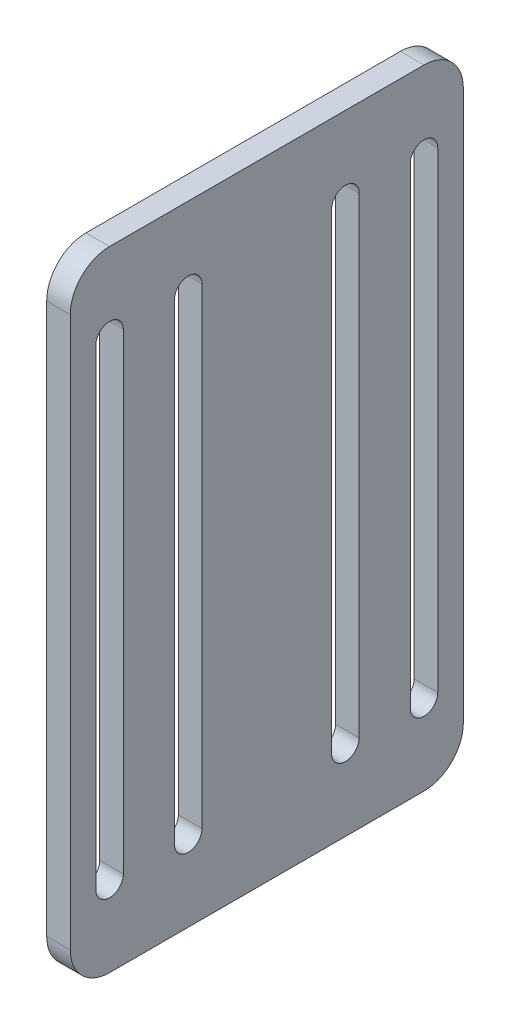
ISO-10303-21;
HEADER;
FILE_DESCRIPTION(('STEP AP214'),'2;1');
FILE_NAME('part.step','',(''),(''),'','','');
FILE_SCHEMA(('AUTOMOTIVE_DESIGN { 1 0 10303 214 1 1 1 1 }'));
ENDSEC;
DATA;
#1=APPLICATION_CONTEXT('core data for automotive mechanical design processes');
#2=APPLICATION_PROTOCOL_DEFINITION('international standard','automotive_design',2000,#1);
#3=PRODUCT_CONTEXT('',#1,'mechanical');
#4=PRODUCT('Part','Part','',(#3));
#5=PRODUCT_RELATED_PRODUCT_CATEGORY('part','',(#4));
#6=PRODUCT_DEFINITION_FORMATION('','',#4);
#7=PRODUCT_DEFINITION_CONTEXT('part definition',#1,'design');
#8=PRODUCT_DEFINITION('design','',#6,#7);
#9=PRODUCT_DEFINITION_SHAPE('','',#8);
#10=(LENGTH_UNIT() NAMED_UNIT(*) SI_UNIT(.MILLI.,.METRE.));
#11=(NAMED_UNIT(*) PLANE_ANGLE_UNIT() SI_UNIT($,.RADIAN.));
#12=(NAMED_UNIT(*) SI_UNIT($,.STERADIAN.) SOLID_ANGLE_UNIT());
#13=UNCERTAINTY_MEASURE_WITH_UNIT(LENGTH_MEASURE(1.E-05),#10,'distance_accuracy_value','');
#14=(GEOMETRIC_REPRESENTATION_CONTEXT(3) GLOBAL_UNCERTAINTY_ASSIGNED_CONTEXT((#13)) GLOBAL_UNIT_ASSIGNED_CONTEXT((#10,
#11,#12)) REPRESENTATION_CONTEXT('',''));
#15=CARTESIAN_POINT('',(0.,0.,0.));
#16=DIRECTION('',(0.,0.,1.));
#17=DIRECTION('',(1.,0.,0.));
#18=AXIS2_PLACEMENT_3D('',#15,#16,#17);
#19=CARTESIAN_POINT('',(3.,0.,-25.));
#20=DIRECTION('',(0.,0.,-1.));
#21=DIRECTION('',(0.,1.,0.));
#22=AXIS2_PLACEMENT_3D('',#19,#20,#21);
#23=PLANE('',#22);
#24=DIRECTION('',(0.,-1.,0.));
#25=VECTOR('',#24,1.);
#26=CARTESIAN_POINT('',(3.,0.,-25.));
#27=LINE('',#26,#25);
#28=CARTESIAN_POINT('',(3.,35.,-25.));
#29=VERTEX_POINT('',#28);
#30=CARTESIAN_POINT('',(3.,-35.,-25.));
#31=VERTEX_POINT('',#30);
#32=EDGE_CURVE('E269',#29,#31,#27,.T.);
#33=ORIENTED_EDGE('',*,*,#32,.T.);
#34=DIRECTION('',(-1.,0.,0.));
#35=VECTOR('',#34,1.);
#36=CARTESIAN_POINT('',(0.,-35.,-25.));
#37=LINE('',#36,#35);
#38=CARTESIAN_POINT('',(0.,-35.,-25.));
#39=VERTEX_POINT('',#38);
#40=EDGE_CURVE('E365',#31,#39,#37,.T.);
#41=ORIENTED_EDGE('',*,*,#40,.T.);
#42=DIRECTION('',(0.,-1.,0.));
#43=VECTOR('',#42,1.);
#44=CARTESIAN_POINT('',(0.,0.,-25.));
#45=LINE('',#44,#43);
#46=CARTESIAN_POINT('',(0.,35.,-25.));
#47=VERTEX_POINT('',#46);
#48=EDGE_CURVE('E326',#47,#39,#45,.T.);
#49=ORIENTED_EDGE('',*,*,#48,.F.);
#50=DIRECTION('',(-1.,0.,0.));
#51=VECTOR('',#50,1.);
#52=CARTESIAN_POINT('',(3.,35.,-25.));
#53=LINE('',#52,#51);
#54=EDGE_CURVE('E345',#47,#29,#53,.F.);
#55=ORIENTED_EDGE('',*,*,#54,.T.);
#56=EDGE_LOOP('',(#33,#41,#49,#55));
#57=FACE_BOUND('',#56,.T.);
#58=ADVANCED_FACE('F41',(#57),#23,.T.);
#59=CARTESIAN_POINT('',(3.,40.,0.));
#60=DIRECTION('',(0.,1.,0.));
#61=DIRECTION('',(0.,0.,1.));
#62=AXIS2_PLACEMENT_3D('',#59,#60,#61);
#63=PLANE('',#62);
#64=DIRECTION('',(0.,0.,-1.));
#65=VECTOR('',#64,1.);
#66=CARTESIAN_POINT('',(0.,40.,0.));
#67=LINE('',#66,#65);
#68=CARTESIAN_POINT('',(0.,40.,20.));
#69=VERTEX_POINT('',#68);
#70=CARTESIAN_POINT('',(0.,40.,-20.));
#71=VERTEX_POINT('',#70);
#72=EDGE_CURVE('E329',#69,#71,#67,.T.);
#73=ORIENTED_EDGE('',*,*,#72,.F.);
#74=DIRECTION('',(-1.,0.,0.));
#75=VECTOR('',#74,1.);
#76=CARTESIAN_POINT('',(3.,40.,20.));
#77=LINE('',#76,#75);
#78=CARTESIAN_POINT('',(3.,40.,20.));
#79=VERTEX_POINT('',#78);
#80=EDGE_CURVE('E11',#69,#79,#77,.F.);
#81=ORIENTED_EDGE('',*,*,#80,.T.);
#82=DIRECTION('',(0.,0.,-1.));
#83=VECTOR('',#82,1.);
#84=CARTESIAN_POINT('',(3.,40.,0.));
#85=LINE('',#84,#83);
#86=CARTESIAN_POINT('',(3.,40.,-20.));
#87=VERTEX_POINT('',#86);
#88=EDGE_CURVE('E272',#79,#87,#85,.T.);
#89=ORIENTED_EDGE('',*,*,#88,.T.);
#90=DIRECTION('',(-1.,0.,0.));
#91=VECTOR('',#90,1.);
#92=CARTESIAN_POINT('',(3.,40.,-20.));
#93=LINE('',#92,#91);
#94=EDGE_CURVE('E49',#87,#71,#93,.T.);
#95=ORIENTED_EDGE('',*,*,#94,.T.);
#96=EDGE_LOOP('',(#73,#81,#89,#95));
#97=FACE_BOUND('',#96,.T.);
#98=ADVANCED_FACE('F395',(#97),#63,.T.);
#99=CARTESIAN_POINT('',(3.,0.,25.));
#100=DIRECTION('',(0.,0.,-1.));
#101=DIRECTION('',(0.,1.,0.));
#102=AXIS2_PLACEMENT_3D('',#99,#100,#101);
#103=PLANE('',#102);
#104=DIRECTION('',(0.,-1.,0.));
#105=VECTOR('',#104,1.);
#106=CARTESIAN_POINT('',(0.,0.,25.));
#107=LINE('',#106,#105);
#108=CARTESIAN_POINT('',(0.,35.,25.));
#109=VERTEX_POINT('',#108);
#110=CARTESIAN_POINT('',(0.,-35.,25.));
#111=VERTEX_POINT('',#110);
#112=EDGE_CURVE('E332',#109,#111,#107,.T.);
#113=ORIENTED_EDGE('',*,*,#112,.T.);
#114=DIRECTION('',(-1.,0.,0.));
#115=VECTOR('',#114,1.);
#116=CARTESIAN_POINT('',(3.,-35.,25.));
#117=LINE('',#116,#115);
#118=CARTESIAN_POINT('',(3.,-35.,25.));
#119=VERTEX_POINT('',#118);
#120=EDGE_CURVE('E56',#111,#119,#117,.F.);
#121=ORIENTED_EDGE('',*,*,#120,.T.);
#122=DIRECTION('',(0.,-1.,0.));
#123=VECTOR('',#122,1.);
#124=CARTESIAN_POINT('',(3.,0.,25.));
#125=LINE('',#124,#123);
#126=CARTESIAN_POINT('',(3.,35.,25.));
#127=VERTEX_POINT('',#126);
#128=EDGE_CURVE('E275',#127,#119,#125,.T.);
#129=ORIENTED_EDGE('',*,*,#128,.F.);
#130=DIRECTION('',(-1.,0.,0.));
#131=VECTOR('',#130,1.);
#132=CARTESIAN_POINT('',(0.,35.,25.));
#133=LINE('',#132,#131);
#134=EDGE_CURVE('E388',#127,#109,#133,.T.);
#135=ORIENTED_EDGE('',*,*,#134,.T.);
#136=EDGE_LOOP('',(#113,#121,#129,#135));
#137=FACE_BOUND('',#136,.T.);
#138=ADVANCED_FACE('F406',(#137),#103,.F.);
#139=CARTESIAN_POINT('',(3.,-30.,20.));
#140=DIRECTION('',(-1.,0.,0.));
#141=DIRECTION('',(0.,0.,1.));
#142=AXIS2_PLACEMENT_3D('',#139,#140,#141);
#143=CYLINDRICAL_SURFACE('',#142,1.74999999999999);
#144=CARTESIAN_POINT('',(0.,-30.,20.));
#145=DIRECTION('',(1.,0.,0.));
#146=DIRECTION('',(0.,0.,-1.));
#147=AXIS2_PLACEMENT_3D('',#144,#145,#146);
#148=CIRCLE('',#147,1.74999999999999);
#149=CARTESIAN_POINT('',(0.,-30.,21.75));
#150=VERTEX_POINT('',#149);
#151=CARTESIAN_POINT('',(0.,-30.,18.25));
#152=VERTEX_POINT('',#151);
#153=EDGE_CURVE('E314',#150,#152,#148,.T.);
#154=ORIENTED_EDGE('',*,*,#153,.F.);
#155=DIRECTION('',(-1.,0.,0.));
#156=VECTOR('',#155,1.);
#157=CARTESIAN_POINT('',(3.,-30.,21.75));
#158=LINE('',#157,#156);
#159=CARTESIAN_POINT('',(3.,-30.,21.75));
#160=VERTEX_POINT('',#159);
#161=EDGE_CURVE('E343',#160,#150,#158,.T.);
#162=ORIENTED_EDGE('',*,*,#161,.F.);
#163=CARTESIAN_POINT('',(3.,-30.,20.));
#164=DIRECTION('',(1.,0.,0.));
#165=DIRECTION('',(0.,0.,-1.));
#166=AXIS2_PLACEMENT_3D('',#163,#164,#165);
#167=CIRCLE('',#166,1.74999999999999);
#168=CARTESIAN_POINT('',(3.,-30.,18.25));
#169=VERTEX_POINT('',#168);
#170=EDGE_CURVE('E257',#160,#169,#167,.T.);
#171=ORIENTED_EDGE('',*,*,#170,.T.);
#172=DIRECTION('',(-1.,0.,0.));
#173=VECTOR('',#172,1.);
#174=CARTESIAN_POINT('',(3.,-30.,18.25));
#175=LINE('',#174,#173);
#176=EDGE_CURVE('E336',#169,#152,#175,.T.);
#177=ORIENTED_EDGE('',*,*,#176,.T.);
#178=EDGE_LOOP('',(#154,#162,#171,#177));
#179=FACE_BOUND('',#178,.T.);
#180=ADVANCED_FACE('F449',(#179),#143,.F.);
#181=CARTESIAN_POINT('',(3.,0.,21.75));
#182=DIRECTION('',(0.,0.,-1.));
#183=DIRECTION('',(0.,1.,0.));
#184=AXIS2_PLACEMENT_3D('',#181,#182,#183);
#185=PLANE('',#184);
#186=DIRECTION('',(0.,-1.,0.));
#187=VECTOR('',#186,1.);
#188=CARTESIAN_POINT('',(0.,0.,21.75));
#189=LINE('',#188,#187);
#190=CARTESIAN_POINT('',(0.,30.,21.75));
#191=VERTEX_POINT('',#190);
#192=EDGE_CURVE('E317',#191,#150,#189,.T.);
#193=ORIENTED_EDGE('',*,*,#192,.F.);
#194=DIRECTION('',(-1.,0.,0.));
#195=VECTOR('',#194,1.);
#196=CARTESIAN_POINT('',(3.,30.,21.75));
#197=LINE('',#196,#195);
#198=CARTESIAN_POINT('',(3.,30.,21.75));
#199=VERTEX_POINT('',#198);
#200=EDGE_CURVE('E341',#199,#191,#197,.T.);
#201=ORIENTED_EDGE('',*,*,#200,.F.);
#202=DIRECTION('',(0.,-1.,0.));
#203=VECTOR('',#202,1.);
#204=CARTESIAN_POINT('',(3.,0.,21.75));
#205=LINE('',#204,#203);
#206=EDGE_CURVE('E260',#199,#160,#205,.T.);
#207=ORIENTED_EDGE('',*,*,#206,.T.);
#208=ORIENTED_EDGE('',*,*,#161,.T.);
#209=EDGE_LOOP('',(#193,#201,#207,#208));
#210=FACE_BOUND('',#209,.T.);
#211=ADVANCED_FACE('F445',(#210),#185,.T.);
#212=CARTESIAN_POINT('',(3.,30.,20.));
#213=DIRECTION('',(-1.,0.,0.));
#214=DIRECTION('',(0.,0.,1.));
#215=AXIS2_PLACEMENT_3D('',#212,#213,#214);
#216=CYLINDRICAL_SURFACE('',#215,1.75);
#217=CARTESIAN_POINT('',(0.,30.,20.));
#218=DIRECTION('',(1.,0.,0.));
#219=DIRECTION('',(0.,0.,-1.));
#220=AXIS2_PLACEMENT_3D('',#217,#218,#219);
#221=CIRCLE('',#220,1.75);
#222=CARTESIAN_POINT('',(0.,30.,18.25));
#223=VERTEX_POINT('',#222);
#224=EDGE_CURVE('E320',#223,#191,#221,.T.);
#225=ORIENTED_EDGE('',*,*,#224,.F.);
#226=DIRECTION('',(-1.,0.,0.));
#227=VECTOR('',#226,1.);
#228=CARTESIAN_POINT('',(3.,30.,18.25));
#229=LINE('',#228,#227);
#230=CARTESIAN_POINT('',(3.,30.,18.25));
#231=VERTEX_POINT('',#230);
#232=EDGE_CURVE('E338',#231,#223,#229,.T.);
#233=ORIENTED_EDGE('',*,*,#232,.F.);
#234=CARTESIAN_POINT('',(3.,30.,20.));
#235=DIRECTION('',(1.,0.,0.));
#236=DIRECTION('',(0.,0.,-1.));
#237=AXIS2_PLACEMENT_3D('',#234,#235,#236);
#238=CIRCLE('',#237,1.75);
#239=EDGE_CURVE('E263',#231,#199,#238,.T.);
#240=ORIENTED_EDGE('',*,*,#239,.T.);
#241=ORIENTED_EDGE('',*,*,#200,.T.);
#242=EDGE_LOOP('',(#225,#233,#240,#241));
#243=FACE_BOUND('',#242,.T.);
#244=ADVANCED_FACE('F441',(#243),#216,.F.);
#245=CARTESIAN_POINT('',(3.,-30.,9.99999999999998));
#246=DIRECTION('',(-1.,0.,0.));
#247=DIRECTION('',(0.,0.,1.));
#248=AXIS2_PLACEMENT_3D('',#245,#246,#247);
#249=CYLINDRICAL_SURFACE('',#248,1.74999999999999);
#250=CARTESIAN_POINT('',(0.,-30.,9.99999999999998));
#251=DIRECTION('',(1.,0.,0.));
#252=DIRECTION('',(0.,0.,-1.));
#253=AXIS2_PLACEMENT_3D('',#250,#251,#252);
#254=CIRCLE('',#253,1.74999999999999);
#255=CARTESIAN_POINT('',(0.,-30.,11.75));
#256=VERTEX_POINT('',#255);
#257=CARTESIAN_POINT('',(0.,-30.,8.24999999999998));
#258=VERTEX_POINT('',#257);
#259=EDGE_CURVE('E302',#256,#258,#254,.T.);
#260=ORIENTED_EDGE('',*,*,#259,.F.);
#261=DIRECTION('',(-1.,0.,0.));
#262=VECTOR('',#261,1.);
#263=CARTESIAN_POINT('',(3.,-30.,11.75));
#264=LINE('',#263,#262);
#265=CARTESIAN_POINT('',(3.,-30.,11.75));
#266=VERTEX_POINT('',#265);
#267=EDGE_CURVE('E339',#266,#256,#264,.T.);
#268=ORIENTED_EDGE('',*,*,#267,.F.);
#269=CARTESIAN_POINT('',(3.,-30.,9.99999999999998));
#270=DIRECTION('',(1.,0.,0.));
#271=DIRECTION('',(0.,0.,-1.));
#272=AXIS2_PLACEMENT_3D('',#269,#270,#271);
#273=CIRCLE('',#272,1.74999999999999);
#274=CARTESIAN_POINT('',(3.,-30.,8.24999999999998));
#275=VERTEX_POINT('',#274);
#276=EDGE_CURVE('E246',#266,#275,#273,.T.);
#277=ORIENTED_EDGE('',*,*,#276,.T.);
#278=DIRECTION('',(-1.,0.,0.));
#279=VECTOR('',#278,1.);
#280=CARTESIAN_POINT('',(3.,-30.,8.24999999999998));
#281=LINE('',#280,#279);
#282=EDGE_CURVE('E346',#275,#258,#281,.T.);
#283=ORIENTED_EDGE('',*,*,#282,.T.);
#284=EDGE_LOOP('',(#260,#268,#277,#283));
#285=FACE_BOUND('',#284,.T.);
#286=ADVANCED_FACE('F444',(#285),#249,.F.);
#287=CARTESIAN_POINT('',(3.,0.,11.75));
#288=DIRECTION('',(0.,0.,-1.));
#289=DIRECTION('',(-1.,0.,0.));
#290=AXIS2_PLACEMENT_3D('',#287,#288,#289);
#291=PLANE('',#290);
#292=DIRECTION('',(0.,-1.,0.));
#293=VECTOR('',#292,1.);
#294=CARTESIAN_POINT('',(0.,0.,11.75));
#295=LINE('',#294,#293);
#296=CARTESIAN_POINT('',(0.,30.,11.75));
#297=VERTEX_POINT('',#296);
#298=EDGE_CURVE('E305',#297,#256,#295,.T.);
#299=ORIENTED_EDGE('',*,*,#298,.F.);
#300=DIRECTION('',(-1.,0.,0.));
#301=VECTOR('',#300,1.);
#302=CARTESIAN_POINT('',(3.,30.,11.75));
#303=LINE('',#302,#301);
#304=CARTESIAN_POINT('',(3.,30.,11.75));
#305=VERTEX_POINT('',#304);
#306=EDGE_CURVE('E351',#305,#297,#303,.T.);
#307=ORIENTED_EDGE('',*,*,#306,.F.);
#308=DIRECTION('',(0.,-1.,0.));
#309=VECTOR('',#308,1.);
#310=CARTESIAN_POINT('',(3.,0.,11.75));
#311=LINE('',#310,#309);
#312=EDGE_CURVE('E249',#305,#266,#311,.T.);
#313=ORIENTED_EDGE('',*,*,#312,.T.);
#314=ORIENTED_EDGE('',*,*,#267,.T.);
#315=EDGE_LOOP('',(#299,#307,#313,#314));
#316=FACE_BOUND('',#315,.T.);
#317=ADVANCED_FACE('F462',(#316),#291,.T.);
#318=CARTESIAN_POINT('',(3.,30.,9.99999999999998));
#319=DIRECTION('',(-1.,0.,0.));
#320=DIRECTION('',(0.,0.,1.));
#321=AXIS2_PLACEMENT_3D('',#318,#319,#320);
#322=CYLINDRICAL_SURFACE('',#321,1.75);
#323=CARTESIAN_POINT('',(0.,30.,9.99999999999998));
#324=DIRECTION('',(1.,0.,0.));
#325=DIRECTION('',(0.,0.,-1.));
#326=AXIS2_PLACEMENT_3D('',#323,#324,#325);
#327=CIRCLE('',#326,1.75);
#328=CARTESIAN_POINT('',(0.,30.,8.24999999999998));
#329=VERTEX_POINT('',#328);
#330=EDGE_CURVE('E308',#329,#297,#327,.T.);
#331=ORIENTED_EDGE('',*,*,#330,.F.);
#332=DIRECTION('',(-1.,0.,0.));
#333=VECTOR('',#332,1.);
#334=CARTESIAN_POINT('',(3.,30.,8.24999999999998));
#335=LINE('',#334,#333);
#336=CARTESIAN_POINT('',(3.,30.,8.24999999999998));
#337=VERTEX_POINT('',#336);
#338=EDGE_CURVE('E348',#337,#329,#335,.T.);
#339=ORIENTED_EDGE('',*,*,#338,.F.);
#340=CARTESIAN_POINT('',(3.,30.,9.99999999999998));
#341=DIRECTION('',(1.,0.,0.));
#342=DIRECTION('',(0.,0.,-1.));
#343=AXIS2_PLACEMENT_3D('',#340,#341,#342);
#344=CIRCLE('',#343,1.75);
#345=EDGE_CURVE('E252',#337,#305,#344,.T.);
#346=ORIENTED_EDGE('',*,*,#345,.T.);
#347=ORIENTED_EDGE('',*,*,#306,.T.);
#348=EDGE_LOOP('',(#331,#339,#346,#347));
#349=FACE_BOUND('',#348,.T.);
#350=ADVANCED_FACE('F458',(#349),#322,.F.);
#351=CARTESIAN_POINT('',(3.,30.,-10.));
#352=DIRECTION('',(-1.,0.,0.));
#353=DIRECTION('',(0.,0.,1.));
#354=AXIS2_PLACEMENT_3D('',#351,#352,#353);
#355=CYLINDRICAL_SURFACE('',#354,1.75);
#356=CARTESIAN_POINT('',(0.,30.,-10.));
#357=DIRECTION('',(1.,0.,0.));
#358=DIRECTION('',(0.,0.,-1.));
#359=AXIS2_PLACEMENT_3D('',#356,#357,#358);
#360=CIRCLE('',#359,1.75);
#361=CARTESIAN_POINT('',(0.,30.,-11.75));
#362=VERTEX_POINT('',#361);
#363=CARTESIAN_POINT('',(0.,30.,-8.25000000000001));
#364=VERTEX_POINT('',#363);
#365=EDGE_CURVE('E290',#362,#364,#360,.T.);
#366=ORIENTED_EDGE('',*,*,#365,.F.);
#367=DIRECTION('',(-1.,0.,0.));
#368=VECTOR('',#367,1.);
#369=CARTESIAN_POINT('',(3.,30.,-11.75));
#370=LINE('',#369,#368);
#371=CARTESIAN_POINT('',(3.,30.,-11.75));
#372=VERTEX_POINT('',#371);
#373=EDGE_CURVE('E349',#372,#362,#370,.T.);
#374=ORIENTED_EDGE('',*,*,#373,.F.);
#375=CARTESIAN_POINT('',(3.,30.,-10.));
#376=DIRECTION('',(1.,0.,0.));
#377=DIRECTION('',(0.,0.,-1.));
#378=AXIS2_PLACEMENT_3D('',#375,#376,#377);
#379=CIRCLE('',#378,1.75);
#380=CARTESIAN_POINT('',(3.,30.,-8.25000000000001));
#381=VERTEX_POINT('',#380);
#382=EDGE_CURVE('E234',#372,#381,#379,.T.);
#383=ORIENTED_EDGE('',*,*,#382,.T.);
#384=DIRECTION('',(-1.,0.,0.));
#385=VECTOR('',#384,1.);
#386=CARTESIAN_POINT('',(3.,30.,-8.25000000000001));
#387=LINE('',#386,#385);
#388=EDGE_CURVE('E214',#381,#364,#387,.T.);
#389=ORIENTED_EDGE('',*,*,#388,.T.);
#390=EDGE_LOOP('',(#366,#374,#383,#389));
#391=FACE_BOUND('',#390,.T.);
#392=ADVANCED_FACE('F461',(#391),#355,.F.);
#393=CARTESIAN_POINT('',(3.,0.,-11.75));
#394=DIRECTION('',(0.,0.,1.));
#395=DIRECTION('',(0.,-1.,0.));
#396=AXIS2_PLACEMENT_3D('',#393,#394,#395);
#397=PLANE('',#396);
#398=DIRECTION('',(0.,1.,0.));
#399=VECTOR('',#398,1.);
#400=CARTESIAN_POINT('',(0.,0.,-11.75));
#401=LINE('',#400,#399);
#402=CARTESIAN_POINT('',(0.,-30.,-11.75));
#403=VERTEX_POINT('',#402);
#404=EDGE_CURVE('E293',#403,#362,#401,.T.);
#405=ORIENTED_EDGE('',*,*,#404,.F.);
#406=DIRECTION('',(-1.,0.,0.));
#407=VECTOR('',#406,1.);
#408=CARTESIAN_POINT('',(3.,-30.,-11.75));
#409=LINE('',#408,#407);
#410=CARTESIAN_POINT('',(3.,-30.,-11.75));
#411=VERTEX_POINT('',#410);
#412=EDGE_CURVE('E357',#411,#403,#409,.T.);
#413=ORIENTED_EDGE('',*,*,#412,.F.);
#414=DIRECTION('',(0.,1.,0.));
#415=VECTOR('',#414,1.);
#416=CARTESIAN_POINT('',(3.,0.,-11.75));
#417=LINE('',#416,#415);
#418=EDGE_CURVE('E237',#411,#372,#417,.T.);
#419=ORIENTED_EDGE('',*,*,#418,.T.);
#420=ORIENTED_EDGE('',*,*,#373,.T.);
#421=EDGE_LOOP('',(#405,#413,#419,#420));
#422=FACE_BOUND('',#421,.T.);
#423=ADVANCED_FACE('F477',(#422),#397,.T.);
#424=CARTESIAN_POINT('',(3.,-30.,-10.));
#425=DIRECTION('',(-1.,0.,0.));
#426=DIRECTION('',(0.,0.,1.));
#427=AXIS2_PLACEMENT_3D('',#424,#425,#426);
#428=CYLINDRICAL_SURFACE('',#427,1.74999999999999);
#429=CARTESIAN_POINT('',(0.,-30.,-10.));
#430=DIRECTION('',(1.,0.,0.));
#431=DIRECTION('',(0.,0.,-1.));
#432=AXIS2_PLACEMENT_3D('',#429,#430,#431);
#433=CIRCLE('',#432,1.74999999999999);
#434=CARTESIAN_POINT('',(0.,-30.,-8.25000000000002));
#435=VERTEX_POINT('',#434);
#436=EDGE_CURVE('E296',#435,#403,#433,.T.);
#437=ORIENTED_EDGE('',*,*,#436,.F.);
#438=DIRECTION('',(-1.,0.,0.));
#439=VECTOR('',#438,1.);
#440=CARTESIAN_POINT('',(3.,-30.,-8.25000000000002));
#441=LINE('',#440,#439);
#442=CARTESIAN_POINT('',(3.,-30.,-8.25000000000002));
#443=VERTEX_POINT('',#442);
#444=EDGE_CURVE('E355',#443,#435,#441,.T.);
#445=ORIENTED_EDGE('',*,*,#444,.F.);
#446=CARTESIAN_POINT('',(3.,-30.,-10.));
#447=DIRECTION('',(1.,0.,0.));
#448=DIRECTION('',(0.,0.,-1.));
#449=AXIS2_PLACEMENT_3D('',#446,#447,#448);
#450=CIRCLE('',#449,1.74999999999999);
#451=EDGE_CURVE('E240',#443,#411,#450,.T.);
#452=ORIENTED_EDGE('',*,*,#451,.T.);
#453=ORIENTED_EDGE('',*,*,#412,.T.);
#454=EDGE_LOOP('',(#437,#445,#452,#453));
#455=FACE_BOUND('',#454,.T.);
#456=ADVANCED_FACE('F474',(#455),#428,.F.);
#457=CARTESIAN_POINT('',(3.,-30.,-20.));
#458=DIRECTION('',(-1.,0.,0.));
#459=DIRECTION('',(0.,0.,1.));
#460=AXIS2_PLACEMENT_3D('',#457,#458,#459);
#461=CYLINDRICAL_SURFACE('',#460,1.75);
#462=CARTESIAN_POINT('',(0.,-30.,-20.));
#463=DIRECTION('',(1.,0.,0.));
#464=DIRECTION('',(0.,0.,-1.));
#465=AXIS2_PLACEMENT_3D('',#462,#463,#464);
#466=CIRCLE('',#465,1.75);
#467=CARTESIAN_POINT('',(0.,-30.,-18.25));
#468=VERTEX_POINT('',#467);
#469=CARTESIAN_POINT('',(0.,-30.,-21.75));
#470=VERTEX_POINT('',#469);
#471=EDGE_CURVE('E209',#468,#470,#466,.T.);
#472=ORIENTED_EDGE('',*,*,#471,.F.);
#473=DIRECTION('',(-1.,0.,0.));
#474=VECTOR('',#473,1.);
#475=CARTESIAN_POINT('',(3.,-30.,-18.25));
#476=LINE('',#475,#474);
#477=CARTESIAN_POINT('',(3.,-30.,-18.25));
#478=VERTEX_POINT('',#477);
#479=EDGE_CURVE('E203',#478,#468,#476,.T.);
#480=ORIENTED_EDGE('',*,*,#479,.F.);
#481=CARTESIAN_POINT('',(3.,-30.,-20.));
#482=DIRECTION('',(1.,0.,0.));
#483=DIRECTION('',(0.,0.,-1.));
#484=AXIS2_PLACEMENT_3D('',#481,#482,#483);
#485=CIRCLE('',#484,1.75);
#486=CARTESIAN_POINT('',(3.,-30.,-21.75));
#487=VERTEX_POINT('',#486);
#488=EDGE_CURVE('E206',#478,#487,#485,.T.);
#489=ORIENTED_EDGE('',*,*,#488,.T.);
#490=DIRECTION('',(-1.,0.,0.));
#491=VECTOR('',#490,1.);
#492=CARTESIAN_POINT('',(3.,-30.,-21.75));
#493=LINE('',#492,#491);
#494=EDGE_CURVE('E280',#487,#470,#493,.T.);
#495=ORIENTED_EDGE('',*,*,#494,.T.);
#496=EDGE_LOOP('',(#472,#480,#489,#495));
#497=FACE_BOUND('',#496,.T.);
#498=ADVANCED_FACE('F205',(#497),#461,.F.);
#499=CARTESIAN_POINT('',(3.,0.,-18.25));
#500=DIRECTION('',(0.,0.,-1.));
#501=DIRECTION('',(-1.,0.,0.));
#502=AXIS2_PLACEMENT_3D('',#499,#500,#501);
#503=PLANE('',#502);
#504=DIRECTION('',(0.,-1.,0.));
#505=VECTOR('',#504,1.);
#506=CARTESIAN_POINT('',(0.,0.,-18.25));
#507=LINE('',#506,#505);
#508=CARTESIAN_POINT('',(0.,30.,-18.25));
#509=VERTEX_POINT('',#508);
#510=EDGE_CURVE('E282',#509,#468,#507,.T.);
#511=ORIENTED_EDGE('',*,*,#510,.F.);
#512=DIRECTION('',(-1.,0.,0.));
#513=VECTOR('',#512,1.);
#514=CARTESIAN_POINT('',(3.,30.,-18.25));
#515=LINE('',#514,#513);
#516=CARTESIAN_POINT('',(3.,30.,-18.25));
#517=VERTEX_POINT('',#516);
#518=EDGE_CURVE('E215',#517,#509,#515,.T.);
#519=ORIENTED_EDGE('',*,*,#518,.F.);
#520=DIRECTION('',(0.,-1.,0.));
#521=VECTOR('',#520,1.);
#522=CARTESIAN_POINT('',(3.,0.,-18.25));
#523=LINE('',#522,#521);
#524=EDGE_CURVE('E222',#517,#478,#523,.T.);
#525=ORIENTED_EDGE('',*,*,#524,.T.);
#526=ORIENTED_EDGE('',*,*,#479,.T.);
#527=EDGE_LOOP('',(#511,#519,#525,#526));
#528=FACE_BOUND('',#527,.T.);
#529=ADVANCED_FACE('F228',(#528),#503,.T.);
#530=CARTESIAN_POINT('',(3.,30.,-20.));
#531=DIRECTION('',(-1.,0.,0.));
#532=DIRECTION('',(0.,0.,1.));
#533=AXIS2_PLACEMENT_3D('',#530,#531,#532);
#534=CYLINDRICAL_SURFACE('',#533,1.75);
#535=CARTESIAN_POINT('',(0.,30.,-20.));
#536=DIRECTION('',(1.,0.,0.));
#537=DIRECTION('',(0.,0.,-1.));
#538=AXIS2_PLACEMENT_3D('',#535,#536,#537);
#539=CIRCLE('',#538,1.75);
#540=CARTESIAN_POINT('',(0.,30.,-21.75));
#541=VERTEX_POINT('',#540);
#542=EDGE_CURVE('E284',#541,#509,#539,.T.);
#543=ORIENTED_EDGE('',*,*,#542,.F.);
#544=DIRECTION('',(-1.,0.,0.));
#545=VECTOR('',#544,1.);
#546=CARTESIAN_POINT('',(3.,30.,-21.75));
#547=LINE('',#546,#545);
#548=CARTESIAN_POINT('',(3.,30.,-21.75));
#549=VERTEX_POINT('',#548);
#550=EDGE_CURVE('E361',#549,#541,#547,.T.);
#551=ORIENTED_EDGE('',*,*,#550,.F.);
#552=CARTESIAN_POINT('',(3.,30.,-20.));
#553=DIRECTION('',(1.,0.,0.));
#554=DIRECTION('',(0.,0.,-1.));
#555=AXIS2_PLACEMENT_3D('',#552,#553,#554);
#556=CIRCLE('',#555,1.75);
#557=EDGE_CURVE('E229',#549,#517,#556,.T.);
#558=ORIENTED_EDGE('',*,*,#557,.T.);
#559=ORIENTED_EDGE('',*,*,#518,.T.);
#560=EDGE_LOOP('',(#543,#551,#558,#559));
#561=FACE_BOUND('',#560,.T.);
#562=ADVANCED_FACE('F439',(#561),#534,.F.);
#563=CARTESIAN_POINT('',(3.,0.,18.25));
#564=DIRECTION('',(0.,0.,1.));
#565=DIRECTION('',(0.,-1.,0.));
#566=AXIS2_PLACEMENT_3D('',#563,#564,#565);
#567=PLANE('',#566);
#568=DIRECTION('',(0.,1.,0.));
#569=VECTOR('',#568,1.);
#570=CARTESIAN_POINT('',(0.,0.,18.25));
#571=LINE('',#570,#569);
#572=EDGE_CURVE('E323',#152,#223,#571,.T.);
#573=ORIENTED_EDGE('',*,*,#572,.F.);
#574=ORIENTED_EDGE('',*,*,#176,.F.);
#575=DIRECTION('',(0.,1.,0.));
#576=VECTOR('',#575,1.);
#577=CARTESIAN_POINT('',(3.,0.,18.25));
#578=LINE('',#577,#576);
#579=EDGE_CURVE('E266',#169,#231,#578,.T.);
#580=ORIENTED_EDGE('',*,*,#579,.T.);
#581=ORIENTED_EDGE('',*,*,#232,.T.);
#582=EDGE_LOOP('',(#573,#574,#580,#581));
#583=FACE_BOUND('',#582,.T.);
#584=ADVANCED_FACE('F435',(#583),#567,.T.);
#585=CARTESIAN_POINT('',(3.,0.,8.24999999999998));
#586=DIRECTION('',(0.,0.,-1.));
#587=DIRECTION('',(-1.,0.,0.));
#588=AXIS2_PLACEMENT_3D('',#585,#586,#587);
#589=PLANE('',#588);
#590=DIRECTION('',(0.,-1.,0.));
#591=VECTOR('',#590,1.);
#592=CARTESIAN_POINT('',(0.,0.,8.24999999999998));
#593=LINE('',#592,#591);
#594=EDGE_CURVE('E311',#329,#258,#593,.T.);
#595=ORIENTED_EDGE('',*,*,#594,.T.);
#596=ORIENTED_EDGE('',*,*,#282,.F.);
#597=DIRECTION('',(0.,-1.,0.));
#598=VECTOR('',#597,1.);
#599=CARTESIAN_POINT('',(3.,0.,8.24999999999998));
#600=LINE('',#599,#598);
#601=EDGE_CURVE('E255',#337,#275,#600,.T.);
#602=ORIENTED_EDGE('',*,*,#601,.F.);
#603=ORIENTED_EDGE('',*,*,#338,.T.);
#604=EDGE_LOOP('',(#595,#596,#602,#603));
#605=FACE_BOUND('',#604,.T.);
#606=ADVANCED_FACE('F438',(#605),#589,.F.);
#607=CARTESIAN_POINT('',(3.,0.,-8.25000000000001));
#608=DIRECTION('',(0.,0.,-1.));
#609=DIRECTION('',(0.,1.,0.));
#610=AXIS2_PLACEMENT_3D('',#607,#608,#609);
#611=PLANE('',#610);
#612=DIRECTION('',(0.,-1.,0.));
#613=VECTOR('',#612,1.);
#614=CARTESIAN_POINT('',(0.,0.,-8.25000000000001));
#615=LINE('',#614,#613);
#616=EDGE_CURVE('E299',#364,#435,#615,.T.);
#617=ORIENTED_EDGE('',*,*,#616,.F.);
#618=ORIENTED_EDGE('',*,*,#388,.F.);
#619=DIRECTION('',(0.,-1.,0.));
#620=VECTOR('',#619,1.);
#621=CARTESIAN_POINT('',(3.,0.,-8.25000000000001));
#622=LINE('',#621,#620);
#623=EDGE_CURVE('E243',#381,#443,#622,.T.);
#624=ORIENTED_EDGE('',*,*,#623,.T.);
#625=ORIENTED_EDGE('',*,*,#444,.T.);
#626=EDGE_LOOP('',(#617,#618,#624,#625));
#627=FACE_BOUND('',#626,.T.);
#628=ADVANCED_FACE('F456',(#627),#611,.T.);
#629=CARTESIAN_POINT('',(3.,0.,-21.75));
#630=DIRECTION('',(0.,0.,1.));
#631=DIRECTION('',(1.,0.,0.));
#632=AXIS2_PLACEMENT_3D('',#629,#630,#631);
#633=PLANE('',#632);
#634=DIRECTION('',(0.,1.,0.));
#635=VECTOR('',#634,1.);
#636=CARTESIAN_POINT('',(0.,0.,-21.75));
#637=LINE('',#636,#635);
#638=EDGE_CURVE('E287',#470,#541,#637,.T.);
#639=ORIENTED_EDGE('',*,*,#638,.F.);
#640=ORIENTED_EDGE('',*,*,#494,.F.);
#641=DIRECTION('',(0.,1.,0.));
#642=VECTOR('',#641,1.);
#643=CARTESIAN_POINT('',(3.,0.,-21.75));
#644=LINE('',#643,#642);
#645=EDGE_CURVE('E225',#487,#549,#644,.T.);
#646=ORIENTED_EDGE('',*,*,#645,.T.);
#647=ORIENTED_EDGE('',*,*,#550,.T.);
#648=EDGE_LOOP('',(#639,#640,#646,#647));
#649=FACE_BOUND('',#648,.T.);
#650=ADVANCED_FACE('F472',(#649),#633,.T.);
#651=CARTESIAN_POINT('',(3.,-40.,0.));
#652=DIRECTION('',(0.,1.,0.));
#653=DIRECTION('',(0.,0.,1.));
#654=AXIS2_PLACEMENT_3D('',#651,#652,#653);
#655=PLANE('',#654);
#656=DIRECTION('',(0.,0.,-1.));
#657=VECTOR('',#656,1.);
#658=CARTESIAN_POINT('',(0.,-40.,0.));
#659=LINE('',#658,#657);
#660=CARTESIAN_POINT('',(0.,-40.,20.));
#661=VERTEX_POINT('',#660);
#662=CARTESIAN_POINT('',(0.,-40.,-20.));
#663=VERTEX_POINT('',#662);
#664=EDGE_CURVE('E226',#661,#663,#659,.T.);
#665=ORIENTED_EDGE('',*,*,#664,.T.);
#666=DIRECTION('',(-1.,0.,0.));
#667=VECTOR('',#666,1.);
#668=CARTESIAN_POINT('',(3.,-40.,-20.));
#669=LINE('',#668,#667);
#670=CARTESIAN_POINT('',(3.,-40.,-20.));
#671=VERTEX_POINT('',#670);
#672=EDGE_CURVE('E379',#663,#671,#669,.F.);
#673=ORIENTED_EDGE('',*,*,#672,.T.);
#674=DIRECTION('',(0.,0.,-1.));
#675=VECTOR('',#674,1.);
#676=CARTESIAN_POINT('',(3.,-40.,0.));
#677=LINE('',#676,#675);
#678=CARTESIAN_POINT('',(3.,-40.,20.));
#679=VERTEX_POINT('',#678);
#680=EDGE_CURVE('E277',#679,#671,#677,.T.);
#681=ORIENTED_EDGE('',*,*,#680,.F.);
#682=DIRECTION('',(-1.,0.,0.));
#683=VECTOR('',#682,1.);
#684=CARTESIAN_POINT('',(3.,-40.,20.));
#685=LINE('',#684,#683);
#686=EDGE_CURVE('E376',#679,#661,#685,.T.);
#687=ORIENTED_EDGE('',*,*,#686,.T.);
#688=EDGE_LOOP('',(#665,#673,#681,#687));
#689=FACE_BOUND('',#688,.T.);
#690=ADVANCED_FACE('F414',(#689),#655,.F.);
#691=CARTESIAN_POINT('',(3.,0.,0.));
#692=DIRECTION('',(1.,0.,0.));
#693=DIRECTION('',(0.,0.,-1.));
#694=AXIS2_PLACEMENT_3D('',#691,#692,#693);
#695=PLANE('',#694);
#696=ORIENTED_EDGE('',*,*,#488,.F.);
#697=ORIENTED_EDGE('',*,*,#524,.F.);
#698=ORIENTED_EDGE('',*,*,#557,.F.);
#699=ORIENTED_EDGE('',*,*,#645,.F.);
#700=EDGE_LOOP('',(#696,#697,#698,#699));
#701=FACE_BOUND('',#700,.T.);
#702=ORIENTED_EDGE('',*,*,#382,.F.);
#703=ORIENTED_EDGE('',*,*,#418,.F.);
#704=ORIENTED_EDGE('',*,*,#451,.F.);
#705=ORIENTED_EDGE('',*,*,#623,.F.);
#706=EDGE_LOOP('',(#702,#703,#704,#705));
#707=FACE_BOUND('',#706,.T.);
#708=ORIENTED_EDGE('',*,*,#276,.F.);
#709=ORIENTED_EDGE('',*,*,#312,.F.);
#710=ORIENTED_EDGE('',*,*,#345,.F.);
#711=ORIENTED_EDGE('',*,*,#601,.T.);
#712=EDGE_LOOP('',(#708,#709,#710,#711));
#713=FACE_BOUND('',#712,.T.);
#714=ORIENTED_EDGE('',*,*,#170,.F.);
#715=ORIENTED_EDGE('',*,*,#206,.F.);
#716=ORIENTED_EDGE('',*,*,#239,.F.);
#717=ORIENTED_EDGE('',*,*,#579,.F.);
#718=EDGE_LOOP('',(#714,#715,#716,#717));
#719=FACE_BOUND('',#718,.T.);
#720=ORIENTED_EDGE('',*,*,#680,.T.);
#721=CARTESIAN_POINT('',(3.,-35.,-20.));
#722=DIRECTION('',(1.,0.,0.));
#723=DIRECTION('',(0.,0.,-1.));
#724=AXIS2_PLACEMENT_3D('',#721,#722,#723);
#725=CIRCLE('',#724,5.);
#726=EDGE_CURVE('E386',#671,#31,#725,.T.);
#727=ORIENTED_EDGE('',*,*,#726,.T.);
#728=ORIENTED_EDGE('',*,*,#32,.F.);
#729=CARTESIAN_POINT('',(3.,35.,-20.));
#730=DIRECTION('',(1.,0.,0.));
#731=DIRECTION('',(0.,0.,-1.));
#732=AXIS2_PLACEMENT_3D('',#729,#730,#731);
#733=CIRCLE('',#732,5.);
#734=EDGE_CURVE('E381',#29,#87,#733,.T.);
#735=ORIENTED_EDGE('',*,*,#734,.T.);
#736=ORIENTED_EDGE('',*,*,#88,.F.);
#737=CARTESIAN_POINT('',(3.,35.,20.));
#738=DIRECTION('',(1.,0.,0.));
#739=DIRECTION('',(0.,0.,-1.));
#740=AXIS2_PLACEMENT_3D('',#737,#738,#739);
#741=CIRCLE('',#740,5.);
#742=EDGE_CURVE('E63',#79,#127,#741,.T.);
#743=ORIENTED_EDGE('',*,*,#742,.T.);
#744=ORIENTED_EDGE('',*,*,#128,.T.);
#745=CARTESIAN_POINT('',(3.,-35.,20.));
#746=DIRECTION('',(1.,0.,0.));
#747=DIRECTION('',(0.,0.,-1.));
#748=AXIS2_PLACEMENT_3D('',#745,#746,#747);
#749=CIRCLE('',#748,5.);
#750=EDGE_CURVE('E384',#119,#679,#749,.T.);
#751=ORIENTED_EDGE('',*,*,#750,.T.);
#752=EDGE_LOOP('',(#720,#727,#728,#735,#736,#743,#744,#751));
#753=FACE_BOUND('',#752,.T.);
#754=ADVANCED_FACE('F219',(#701,#707,#713,#719,#753),#695,.T.);
#755=CARTESIAN_POINT('',(0.,0.,0.));
#756=DIRECTION('',(1.,0.,0.));
#757=DIRECTION('',(0.,0.,-1.));
#758=AXIS2_PLACEMENT_3D('',#755,#756,#757);
#759=PLANE('',#758);
#760=ORIENTED_EDGE('',*,*,#471,.T.);
#761=ORIENTED_EDGE('',*,*,#638,.T.);
#762=ORIENTED_EDGE('',*,*,#542,.T.);
#763=ORIENTED_EDGE('',*,*,#510,.T.);
#764=EDGE_LOOP('',(#760,#761,#762,#763));
#765=FACE_BOUND('',#764,.T.);
#766=ORIENTED_EDGE('',*,*,#365,.T.);
#767=ORIENTED_EDGE('',*,*,#616,.T.);
#768=ORIENTED_EDGE('',*,*,#436,.T.);
#769=ORIENTED_EDGE('',*,*,#404,.T.);
#770=EDGE_LOOP('',(#766,#767,#768,#769));
#771=FACE_BOUND('',#770,.T.);
#772=ORIENTED_EDGE('',*,*,#259,.T.);
#773=ORIENTED_EDGE('',*,*,#594,.F.);
#774=ORIENTED_EDGE('',*,*,#330,.T.);
#775=ORIENTED_EDGE('',*,*,#298,.T.);
#776=EDGE_LOOP('',(#772,#773,#774,#775));
#777=FACE_BOUND('',#776,.T.);
#778=ORIENTED_EDGE('',*,*,#153,.T.);
#779=ORIENTED_EDGE('',*,*,#572,.T.);
#780=ORIENTED_EDGE('',*,*,#224,.T.);
#781=ORIENTED_EDGE('',*,*,#192,.T.);
#782=EDGE_LOOP('',(#778,#779,#780,#781));
#783=FACE_BOUND('',#782,.T.);
#784=ORIENTED_EDGE('',*,*,#48,.T.);
#785=CARTESIAN_POINT('',(0.,-35.,-20.));
#786=DIRECTION('',(1.,0.,0.));
#787=DIRECTION('',(0.,0.,-1.));
#788=AXIS2_PLACEMENT_3D('',#785,#786,#787);
#789=CIRCLE('',#788,5.);
#790=EDGE_CURVE('E374',#39,#663,#789,.F.);
#791=ORIENTED_EDGE('',*,*,#790,.T.);
#792=ORIENTED_EDGE('',*,*,#664,.F.);
#793=CARTESIAN_POINT('',(0.,-35.,20.));
#794=DIRECTION('',(1.,0.,0.));
#795=DIRECTION('',(0.,0.,-1.));
#796=AXIS2_PLACEMENT_3D('',#793,#794,#795);
#797=CIRCLE('',#796,5.);
#798=EDGE_CURVE('E372',#661,#111,#797,.F.);
#799=ORIENTED_EDGE('',*,*,#798,.T.);
#800=ORIENTED_EDGE('',*,*,#112,.F.);
#801=CARTESIAN_POINT('',(0.,35.,20.));
#802=DIRECTION('',(1.,0.,0.));
#803=DIRECTION('',(0.,0.,-1.));
#804=AXIS2_PLACEMENT_3D('',#801,#802,#803);
#805=CIRCLE('',#804,5.);
#806=EDGE_CURVE('E370',#109,#69,#805,.F.);
#807=ORIENTED_EDGE('',*,*,#806,.T.);
#808=ORIENTED_EDGE('',*,*,#72,.T.);
#809=CARTESIAN_POINT('',(0.,35.,-20.));
#810=DIRECTION('',(1.,0.,0.));
#811=DIRECTION('',(0.,0.,-1.));
#812=AXIS2_PLACEMENT_3D('',#809,#810,#811);
#813=CIRCLE('',#812,5.);
#814=EDGE_CURVE('E368',#71,#47,#813,.F.);
#815=ORIENTED_EDGE('',*,*,#814,.T.);
#816=EDGE_LOOP('',(#784,#791,#792,#799,#800,#807,#808,#815));
#817=FACE_BOUND('',#816,.T.);
#818=ADVANCED_FACE('F400',(#765,#771,#777,#783,#817),#759,.F.);
#819=CARTESIAN_POINT('',(3.,-35.,-20.));
#820=DIRECTION('',(1.,0.,0.));
#821=DIRECTION('',(0.,0.,-1.));
#822=AXIS2_PLACEMENT_3D('',#819,#820,#821);
#823=CYLINDRICAL_SURFACE('',#822,5.);
#824=ORIENTED_EDGE('',*,*,#726,.F.);
#825=ORIENTED_EDGE('',*,*,#672,.F.);
#826=ORIENTED_EDGE('',*,*,#790,.F.);
#827=ORIENTED_EDGE('',*,*,#40,.F.);
#828=EDGE_LOOP('',(#824,#825,#826,#827));
#829=FACE_BOUND('',#828,.T.);
#830=ADVANCED_FACE('F419',(#829),#823,.T.);
#831=CARTESIAN_POINT('',(3.,-35.,20.));
#832=DIRECTION('',(-1.,0.,0.));
#833=DIRECTION('',(0.,0.,1.));
#834=AXIS2_PLACEMENT_3D('',#831,#832,#833);
#835=CYLINDRICAL_SURFACE('',#834,5.);
#836=ORIENTED_EDGE('',*,*,#750,.F.);
#837=ORIENTED_EDGE('',*,*,#120,.F.);
#838=ORIENTED_EDGE('',*,*,#798,.F.);
#839=ORIENTED_EDGE('',*,*,#686,.F.);
#840=EDGE_LOOP('',(#836,#837,#838,#839));
#841=FACE_BOUND('',#840,.T.);
#842=ADVANCED_FACE('F411',(#841),#835,.T.);
#843=CARTESIAN_POINT('',(3.,35.,20.));
#844=DIRECTION('',(1.,0.,0.));
#845=DIRECTION('',(0.,0.,-1.));
#846=AXIS2_PLACEMENT_3D('',#843,#844,#845);
#847=CYLINDRICAL_SURFACE('',#846,5.);
#848=ORIENTED_EDGE('',*,*,#742,.F.);
#849=ORIENTED_EDGE('',*,*,#80,.F.);
#850=ORIENTED_EDGE('',*,*,#806,.F.);
#851=ORIENTED_EDGE('',*,*,#134,.F.);
#852=EDGE_LOOP('',(#848,#849,#850,#851));
#853=FACE_BOUND('',#852,.T.);
#854=ADVANCED_FACE('F405',(#853),#847,.T.);
#855=CARTESIAN_POINT('',(3.,35.,-20.));
#856=DIRECTION('',(-1.,0.,0.));
#857=DIRECTION('',(0.,0.,1.));
#858=AXIS2_PLACEMENT_3D('',#855,#856,#857);
#859=CYLINDRICAL_SURFACE('',#858,5.);
#860=ORIENTED_EDGE('',*,*,#734,.F.);
#861=ORIENTED_EDGE('',*,*,#54,.F.);
#862=ORIENTED_EDGE('',*,*,#814,.F.);
#863=ORIENTED_EDGE('',*,*,#94,.F.);
#864=EDGE_LOOP('',(#860,#861,#862,#863));
#865=FACE_BOUND('',#864,.T.);
#866=ADVANCED_FACE('F43',(#865),#859,.T.);
#867=CLOSED_SHELL('',(#58,#98,#138,#180,#211,#244,#286,#317,#350,#392,#423,#456,#498,#529,#562,
#584,#606,#628,#650,#690,#754,#818,#830,#842,#854,#866));
#868=MANIFOLD_SOLID_BREP('B2',#867);
#869=ADVANCED_BREP_SHAPE_REPRESENTATION('',(#18,#868),#14);
#870=SHAPE_DEFINITION_REPRESENTATION(#9,#869);
ENDSEC;
END-ISO-10303-21;
